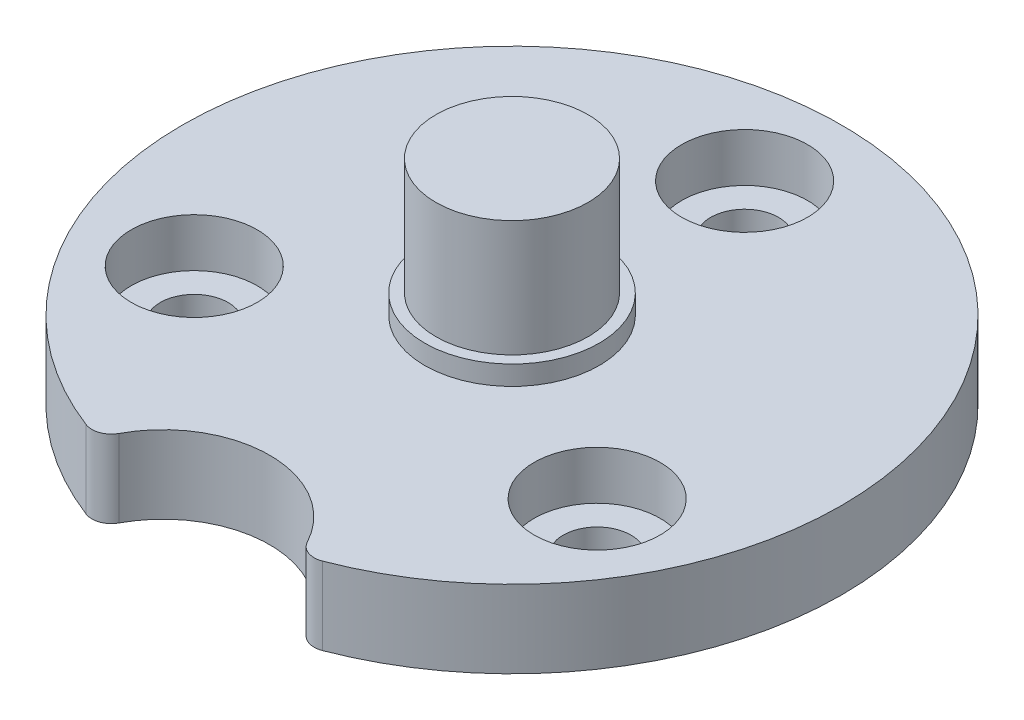
ISO-10303-21;
HEADER;
FILE_DESCRIPTION(('STEP AP214'),'2;1');
FILE_NAME('part.step','',(''),(''),'','','');
FILE_SCHEMA(('AUTOMOTIVE_DESIGN { 1 0 10303 214 1 1 1 1 }'));
ENDSEC;
DATA;
#1=APPLICATION_CONTEXT('core data for automotive mechanical design processes');
#2=APPLICATION_PROTOCOL_DEFINITION('international standard','automotive_design',2000,#1);
#3=PRODUCT_CONTEXT('',#1,'mechanical');
#4=PRODUCT('Part','Part','',(#3));
#5=PRODUCT_RELATED_PRODUCT_CATEGORY('part','',(#4));
#6=PRODUCT_DEFINITION_FORMATION('','',#4);
#7=PRODUCT_DEFINITION_CONTEXT('part definition',#1,'design');
#8=PRODUCT_DEFINITION('design','',#6,#7);
#9=PRODUCT_DEFINITION_SHAPE('','',#8);
#10=(LENGTH_UNIT() NAMED_UNIT(*) SI_UNIT(.MILLI.,.METRE.));
#11=(NAMED_UNIT(*) PLANE_ANGLE_UNIT() SI_UNIT($,.RADIAN.));
#12=(NAMED_UNIT(*) SI_UNIT($,.STERADIAN.) SOLID_ANGLE_UNIT());
#13=UNCERTAINTY_MEASURE_WITH_UNIT(LENGTH_MEASURE(1.E-05),#10,'distance_accuracy_value','');
#14=(GEOMETRIC_REPRESENTATION_CONTEXT(3) GLOBAL_UNCERTAINTY_ASSIGNED_CONTEXT((#13)) GLOBAL_UNIT_ASSIGNED_CONTEXT((#10,
#11,#12)) REPRESENTATION_CONTEXT('',''));
#15=CARTESIAN_POINT('',(0.,0.,0.));
#16=DIRECTION('',(0.,0.,1.));
#17=DIRECTION('',(1.,0.,0.));
#18=AXIS2_PLACEMENT_3D('',#15,#16,#17);
#19=CARTESIAN_POINT('',(0.,4.,-12.));
#20=DIRECTION('',(0.,-1.,0.));
#21=DIRECTION('',(0.,0.,-1.));
#22=AXIS2_PLACEMENT_3D('',#19,#20,#21);
#23=CYLINDRICAL_SURFACE('',#22,1.75);
#24=CARTESIAN_POINT('',(0.,0.,-12.));
#25=DIRECTION('',(0.,1.,0.));
#26=DIRECTION('',(0.,0.,1.));
#27=AXIS2_PLACEMENT_3D('',#24,#25,#26);
#28=CIRCLE('',#27,1.75);
#29=CARTESIAN_POINT('',(0.,0.,-10.25));
#30=VERTEX_POINT('',#29);
#31=EDGE_CURVE('E145',#30,#30,#28,.T.);
#32=ORIENTED_EDGE('',*,*,#31,.F.);
#33=EDGE_LOOP('',(#32));
#34=FACE_BOUND('',#33,.T.);
#35=CARTESIAN_POINT('',(0.,1.5,-12.));
#36=DIRECTION('',(0.,1.,0.));
#37=DIRECTION('',(0.,0.,1.));
#38=AXIS2_PLACEMENT_3D('',#35,#36,#37);
#39=CIRCLE('',#38,1.75);
#40=CARTESIAN_POINT('',(0.,1.5,-10.25));
#41=VERTEX_POINT('',#40);
#42=EDGE_CURVE('E142',#41,#41,#39,.T.);
#43=ORIENTED_EDGE('',*,*,#42,.T.);
#44=EDGE_LOOP('',(#43));
#45=FACE_BOUND('',#44,.T.);
#46=ADVANCED_FACE('F40',(#34,#45),#23,.F.);
#47=CARTESIAN_POINT('',(10.3923048454138,4.,5.99999999999971));
#48=DIRECTION('',(0.,-1.,0.));
#49=DIRECTION('',(0.,0.,-1.));
#50=AXIS2_PLACEMENT_3D('',#47,#48,#49);
#51=CYLINDRICAL_SURFACE('',#50,1.75);
#52=CARTESIAN_POINT('',(10.3923048454138,0.,5.99999999999971));
#53=DIRECTION('',(0.,1.,0.));
#54=DIRECTION('',(0.,0.,1.));
#55=AXIS2_PLACEMENT_3D('',#52,#53,#54);
#56=CIRCLE('',#55,1.75);
#57=CARTESIAN_POINT('',(10.3923048454138,0.,7.74999999999971));
#58=VERTEX_POINT('',#57);
#59=EDGE_CURVE('E141',#58,#58,#56,.T.);
#60=ORIENTED_EDGE('',*,*,#59,.F.);
#61=EDGE_LOOP('',(#60));
#62=FACE_BOUND('',#61,.T.);
#63=CARTESIAN_POINT('',(10.3923048454138,1.5,5.99999999999971));
#64=DIRECTION('',(0.,1.,0.));
#65=DIRECTION('',(0.,0.,1.));
#66=AXIS2_PLACEMENT_3D('',#63,#64,#65);
#67=CIRCLE('',#66,1.75);
#68=CARTESIAN_POINT('',(10.3923048454138,1.5,7.74999999999971));
#69=VERTEX_POINT('',#68);
#70=EDGE_CURVE('E153',#69,#69,#67,.T.);
#71=ORIENTED_EDGE('',*,*,#70,.T.);
#72=EDGE_LOOP('',(#71));
#73=FACE_BOUND('',#72,.T.);
#74=ADVANCED_FACE('F193',(#62,#73),#51,.F.);
#75=CARTESIAN_POINT('',(-10.3923048454128,4.,6.0000000000003));
#76=DIRECTION('',(0.,-1.,0.));
#77=DIRECTION('',(0.,0.,-1.));
#78=AXIS2_PLACEMENT_3D('',#75,#76,#77);
#79=CYLINDRICAL_SURFACE('',#78,1.75);
#80=CARTESIAN_POINT('',(-10.3923048454128,0.,6.0000000000003));
#81=DIRECTION('',(0.,1.,0.));
#82=DIRECTION('',(0.,0.,1.));
#83=AXIS2_PLACEMENT_3D('',#80,#81,#82);
#84=CIRCLE('',#83,1.75);
#85=CARTESIAN_POINT('',(-10.3923048454128,0.,7.7500000000003));
#86=VERTEX_POINT('',#85);
#87=EDGE_CURVE('E138',#86,#86,#84,.T.);
#88=ORIENTED_EDGE('',*,*,#87,.F.);
#89=EDGE_LOOP('',(#88));
#90=FACE_BOUND('',#89,.T.);
#91=CARTESIAN_POINT('',(-10.3923048454128,1.5,6.0000000000003));
#92=DIRECTION('',(0.,1.,0.));
#93=DIRECTION('',(0.,0.,1.));
#94=AXIS2_PLACEMENT_3D('',#91,#92,#93);
#95=CIRCLE('',#94,1.75);
#96=CARTESIAN_POINT('',(-10.3923048454128,1.5,7.7500000000003));
#97=VERTEX_POINT('',#96);
#98=EDGE_CURVE('E123',#97,#97,#95,.T.);
#99=ORIENTED_EDGE('',*,*,#98,.T.);
#100=EDGE_LOOP('',(#99));
#101=FACE_BOUND('',#100,.T.);
#102=ADVANCED_FACE('F167',(#90,#101),#79,.F.);
#103=CARTESIAN_POINT('',(0.,4.,0.));
#104=DIRECTION('',(0.,1.,0.));
#105=DIRECTION('',(0.,0.,1.));
#106=AXIS2_PLACEMENT_3D('',#103,#104,#105);
#107=PLANE('',#106);
#108=CARTESIAN_POINT('',(0.,4.,0.));
#109=DIRECTION('',(0.,1.,0.));
#110=DIRECTION('',(0.,0.,1.));
#111=AXIS2_PLACEMENT_3D('',#108,#109,#110);
#112=CIRCLE('',#111,17.);
#113=CARTESIAN_POINT('',(6.09166505798792,4.,15.87109375));
#114=VERTEX_POINT('',#113);
#115=CARTESIAN_POINT('',(-6.09166505798792,4.,15.87109375));
#116=VERTEX_POINT('',#115);
#117=EDGE_CURVE('E113',#114,#116,#112,.T.);
#118=ORIENTED_EDGE('',*,*,#117,.T.);
#119=CARTESIAN_POINT('',(-5.73333181928275,4.,14.9375));
#120=DIRECTION('',(0.,1.,0.));
#121=DIRECTION('',(0.,0.,1.));
#122=AXIS2_PLACEMENT_3D('',#119,#120,#121);
#123=CIRCLE('',#122,1.);
#124=CARTESIAN_POINT('',(-4.85128077016232,4.,15.4086538461538));
#125=VERTEX_POINT('',#124);
#126=EDGE_CURVE('E11',#116,#125,#123,.T.);
#127=ORIENTED_EDGE('',*,*,#126,.T.);
#128=CARTESIAN_POINT('',(0.,4.,18.));
#129=DIRECTION('',(0.,1.,0.));
#130=DIRECTION('',(0.,0.,1.));
#131=AXIS2_PLACEMENT_3D('',#128,#129,#130);
#132=CIRCLE('',#131,5.5);
#133=CARTESIAN_POINT('',(4.85128077016232,4.,15.4086538461538));
#134=VERTEX_POINT('',#133);
#135=EDGE_CURVE('E97',#134,#125,#132,.T.);
#136=ORIENTED_EDGE('',*,*,#135,.F.);
#137=CARTESIAN_POINT('',(5.73333181928275,4.,14.9375));
#138=DIRECTION('',(0.,1.,0.));
#139=DIRECTION('',(0.,0.,1.));
#140=AXIS2_PLACEMENT_3D('',#137,#138,#139);
#141=CIRCLE('',#140,1.);
#142=EDGE_CURVE('E48',#134,#114,#141,.T.);
#143=ORIENTED_EDGE('',*,*,#142,.T.);
#144=EDGE_LOOP('',(#118,#127,#136,#143));
#145=FACE_BOUND('',#144,.T.);
#146=CARTESIAN_POINT('',(0.,4.,0.));
#147=DIRECTION('',(0.,1.,0.));
#148=DIRECTION('',(0.,0.,1.));
#149=AXIS2_PLACEMENT_3D('',#146,#147,#148);
#150=CIRCLE('',#149,4.5);
#151=CARTESIAN_POINT('',(0.,4.,4.5));
#152=VERTEX_POINT('',#151);
#153=EDGE_CURVE('E106',#152,#152,#150,.T.);
#154=ORIENTED_EDGE('',*,*,#153,.F.);
#155=EDGE_LOOP('',(#154));
#156=FACE_BOUND('',#155,.T.);
#157=CARTESIAN_POINT('',(0.,4.,-12.));
#158=DIRECTION('',(0.,1.,0.));
#159=DIRECTION('',(0.,0.,1.));
#160=AXIS2_PLACEMENT_3D('',#157,#158,#159);
#161=CIRCLE('',#160,3.25);
#162=CARTESIAN_POINT('',(0.,4.,-8.75));
#163=VERTEX_POINT('',#162);
#164=EDGE_CURVE('E124',#163,#163,#161,.T.);
#165=ORIENTED_EDGE('',*,*,#164,.F.);
#166=EDGE_LOOP('',(#165));
#167=FACE_BOUND('',#166,.T.);
#168=CARTESIAN_POINT('',(10.3923048454133,4.,6.));
#169=DIRECTION('',(0.,1.,0.));
#170=DIRECTION('',(0.,0.,1.));
#171=AXIS2_PLACEMENT_3D('',#168,#169,#170);
#172=CIRCLE('',#171,3.25);
#173=CARTESIAN_POINT('',(10.3923048454133,4.,9.25));
#174=VERTEX_POINT('',#173);
#175=EDGE_CURVE('E130',#174,#174,#172,.T.);
#176=ORIENTED_EDGE('',*,*,#175,.F.);
#177=EDGE_LOOP('',(#176));
#178=FACE_BOUND('',#177,.T.);
#179=CARTESIAN_POINT('',(-10.3923048454133,4.,6.00000000000001));
#180=DIRECTION('',(0.,1.,0.));
#181=DIRECTION('',(0.,0.,1.));
#182=AXIS2_PLACEMENT_3D('',#179,#180,#181);
#183=CIRCLE('',#182,3.25);
#184=CARTESIAN_POINT('',(-10.3923048454133,4.,9.25000000000001));
#185=VERTEX_POINT('',#184);
#186=EDGE_CURVE('E117',#185,#185,#183,.T.);
#187=ORIENTED_EDGE('',*,*,#186,.F.);
#188=EDGE_LOOP('',(#187));
#189=FACE_BOUND('',#188,.T.);
#190=ADVANCED_FACE('F164',(#145,#156,#167,#178,#189),#107,.T.);
#191=CARTESIAN_POINT('',(0.,0.,0.));
#192=DIRECTION('',(0.,1.,0.));
#193=DIRECTION('',(0.,0.,1.));
#194=AXIS2_PLACEMENT_3D('',#191,#192,#193);
#195=PLANE('',#194);
#196=CARTESIAN_POINT('',(0.,0.,18.));
#197=DIRECTION('',(0.,1.,0.));
#198=DIRECTION('',(0.,0.,1.));
#199=AXIS2_PLACEMENT_3D('',#196,#197,#198);
#200=CIRCLE('',#199,5.5);
#201=CARTESIAN_POINT('',(-4.85128077016232,0.,15.4086538461538));
#202=VERTEX_POINT('',#201);
#203=CARTESIAN_POINT('',(4.85128077016232,0.,15.4086538461538));
#204=VERTEX_POINT('',#203);
#205=EDGE_CURVE('E95',#202,#204,#200,.F.);
#206=ORIENTED_EDGE('',*,*,#205,.F.);
#207=CARTESIAN_POINT('',(-5.73333181928275,0.,14.9375));
#208=DIRECTION('',(0.,1.,0.));
#209=DIRECTION('',(0.,0.,1.));
#210=AXIS2_PLACEMENT_3D('',#207,#208,#209);
#211=CIRCLE('',#210,1.);
#212=CARTESIAN_POINT('',(-6.09166505798792,0.,15.87109375));
#213=VERTEX_POINT('',#212);
#214=EDGE_CURVE('E79',#202,#213,#211,.F.);
#215=ORIENTED_EDGE('',*,*,#214,.T.);
#216=CARTESIAN_POINT('',(0.,0.,0.));
#217=DIRECTION('',(0.,1.,0.));
#218=DIRECTION('',(0.,0.,1.));
#219=AXIS2_PLACEMENT_3D('',#216,#217,#218);
#220=CIRCLE('',#219,17.);
#221=CARTESIAN_POINT('',(6.09166505798792,0.,15.87109375));
#222=VERTEX_POINT('',#221);
#223=EDGE_CURVE('E148',#222,#213,#220,.T.);
#224=ORIENTED_EDGE('',*,*,#223,.F.);
#225=CARTESIAN_POINT('',(5.73333181928275,0.,14.9375));
#226=DIRECTION('',(0.,1.,0.));
#227=DIRECTION('',(0.,0.,1.));
#228=AXIS2_PLACEMENT_3D('',#225,#226,#227);
#229=CIRCLE('',#228,1.);
#230=EDGE_CURVE('E88',#222,#204,#229,.F.);
#231=ORIENTED_EDGE('',*,*,#230,.T.);
#232=EDGE_LOOP('',(#206,#215,#224,#231));
#233=FACE_BOUND('',#232,.T.);
#234=ORIENTED_EDGE('',*,*,#31,.T.);
#235=EDGE_LOOP('',(#234));
#236=FACE_BOUND('',#235,.T.);
#237=ORIENTED_EDGE('',*,*,#59,.T.);
#238=EDGE_LOOP('',(#237));
#239=FACE_BOUND('',#238,.T.);
#240=ORIENTED_EDGE('',*,*,#87,.T.);
#241=EDGE_LOOP('',(#240));
#242=FACE_BOUND('',#241,.T.);
#243=ADVANCED_FACE('F100',(#233,#236,#239,#242),#195,.F.);
#244=CARTESIAN_POINT('',(0.,4.,0.));
#245=DIRECTION('',(0.,-1.,0.));
#246=DIRECTION('',(0.,0.,-1.));
#247=AXIS2_PLACEMENT_3D('',#244,#245,#246);
#248=CYLINDRICAL_SURFACE('',#247,17.);
#249=ORIENTED_EDGE('',*,*,#223,.T.);
#250=DIRECTION('',(0.,-1.,0.));
#251=VECTOR('',#250,1.);
#252=CARTESIAN_POINT('',(-6.09166505798792,4.,15.87109375));
#253=LINE('',#252,#251);
#254=EDGE_CURVE('E55',#213,#116,#253,.F.);
#255=ORIENTED_EDGE('',*,*,#254,.T.);
#256=ORIENTED_EDGE('',*,*,#117,.F.);
#257=DIRECTION('',(0.,-1.,0.));
#258=VECTOR('',#257,1.);
#259=CARTESIAN_POINT('',(6.09166505798792,4.,15.87109375));
#260=LINE('',#259,#258);
#261=EDGE_CURVE('E87',#114,#222,#260,.T.);
#262=ORIENTED_EDGE('',*,*,#261,.T.);
#263=EDGE_LOOP('',(#249,#255,#256,#262));
#264=FACE_BOUND('',#263,.T.);
#265=ADVANCED_FACE('F162',(#264),#248,.T.);
#266=CARTESIAN_POINT('',(-10.3923048454133,1.5,6.00000000000001));
#267=DIRECTION('',(0.,1.,0.));
#268=DIRECTION('',(0.,0.,1.));
#269=AXIS2_PLACEMENT_3D('',#266,#267,#268);
#270=CYLINDRICAL_SURFACE('',#269,3.25);
#271=CARTESIAN_POINT('',(-10.3923048454133,1.5,6.00000000000001));
#272=DIRECTION('',(0.,1.,0.));
#273=DIRECTION('',(0.,0.,1.));
#274=AXIS2_PLACEMENT_3D('',#271,#272,#273);
#275=CIRCLE('',#274,3.25);
#276=CARTESIAN_POINT('',(-10.3923048454133,1.5,9.25000000000001));
#277=VERTEX_POINT('',#276);
#278=EDGE_CURVE('E133',#277,#277,#275,.T.);
#279=ORIENTED_EDGE('',*,*,#278,.F.);
#280=EDGE_LOOP('',(#279));
#281=FACE_BOUND('',#280,.T.);
#282=ORIENTED_EDGE('',*,*,#186,.T.);
#283=EDGE_LOOP('',(#282));
#284=FACE_BOUND('',#283,.T.);
#285=ADVANCED_FACE('F177',(#281,#284),#270,.F.);
#286=CARTESIAN_POINT('',(-10.3923048454133,1.5,6.00000000000001));
#287=DIRECTION('',(0.,1.,0.));
#288=DIRECTION('',(0.,0.,1.));
#289=AXIS2_PLACEMENT_3D('',#286,#287,#288);
#290=PLANE('',#289);
#291=ORIENTED_EDGE('',*,*,#98,.F.);
#292=EDGE_LOOP('',(#291));
#293=FACE_BOUND('',#292,.T.);
#294=ORIENTED_EDGE('',*,*,#278,.T.);
#295=EDGE_LOOP('',(#294));
#296=FACE_BOUND('',#295,.T.);
#297=ADVANCED_FACE('F179',(#293,#296),#290,.T.);
#298=CARTESIAN_POINT('',(10.3923048454133,1.5,6.));
#299=DIRECTION('',(0.,1.,0.));
#300=DIRECTION('',(0.,0.,1.));
#301=AXIS2_PLACEMENT_3D('',#298,#299,#300);
#302=CYLINDRICAL_SURFACE('',#301,3.25);
#303=CARTESIAN_POINT('',(10.3923048454133,1.5,6.));
#304=DIRECTION('',(0.,1.,0.));
#305=DIRECTION('',(0.,0.,1.));
#306=AXIS2_PLACEMENT_3D('',#303,#304,#305);
#307=CIRCLE('',#306,3.25);
#308=CARTESIAN_POINT('',(10.3923048454133,1.5,9.25));
#309=VERTEX_POINT('',#308);
#310=EDGE_CURVE('E127',#309,#309,#307,.T.);
#311=ORIENTED_EDGE('',*,*,#310,.F.);
#312=EDGE_LOOP('',(#311));
#313=FACE_BOUND('',#312,.T.);
#314=ORIENTED_EDGE('',*,*,#175,.T.);
#315=EDGE_LOOP('',(#314));
#316=FACE_BOUND('',#315,.T.);
#317=ADVANCED_FACE('F186',(#313,#316),#302,.F.);
#318=CARTESIAN_POINT('',(10.3923048454133,1.5,6.));
#319=DIRECTION('',(0.,1.,0.));
#320=DIRECTION('',(0.,0.,1.));
#321=AXIS2_PLACEMENT_3D('',#318,#319,#320);
#322=PLANE('',#321);
#323=ORIENTED_EDGE('',*,*,#70,.F.);
#324=EDGE_LOOP('',(#323));
#325=FACE_BOUND('',#324,.T.);
#326=ORIENTED_EDGE('',*,*,#310,.T.);
#327=EDGE_LOOP('',(#326));
#328=FACE_BOUND('',#327,.T.);
#329=ADVANCED_FACE('F237',(#325,#328),#322,.T.);
#330=CARTESIAN_POINT('',(0.,1.5,-12.));
#331=DIRECTION('',(0.,1.,0.));
#332=DIRECTION('',(0.,0.,1.));
#333=AXIS2_PLACEMENT_3D('',#330,#331,#332);
#334=CYLINDRICAL_SURFACE('',#333,3.25);
#335=CARTESIAN_POINT('',(0.,1.5,-12.));
#336=DIRECTION('',(0.,1.,0.));
#337=DIRECTION('',(0.,0.,1.));
#338=AXIS2_PLACEMENT_3D('',#335,#336,#337);
#339=CIRCLE('',#338,3.25);
#340=CARTESIAN_POINT('',(0.,1.5,-8.75));
#341=VERTEX_POINT('',#340);
#342=EDGE_CURVE('E120',#341,#341,#339,.T.);
#343=ORIENTED_EDGE('',*,*,#342,.F.);
#344=EDGE_LOOP('',(#343));
#345=FACE_BOUND('',#344,.T.);
#346=ORIENTED_EDGE('',*,*,#164,.T.);
#347=EDGE_LOOP('',(#346));
#348=FACE_BOUND('',#347,.T.);
#349=ADVANCED_FACE('F233',(#345,#348),#334,.F.);
#350=CARTESIAN_POINT('',(0.,1.5,-12.));
#351=DIRECTION('',(0.,1.,0.));
#352=DIRECTION('',(0.,0.,1.));
#353=AXIS2_PLACEMENT_3D('',#350,#351,#352);
#354=PLANE('',#353);
#355=ORIENTED_EDGE('',*,*,#42,.F.);
#356=EDGE_LOOP('',(#355));
#357=FACE_BOUND('',#356,.T.);
#358=ORIENTED_EDGE('',*,*,#342,.T.);
#359=EDGE_LOOP('',(#358));
#360=FACE_BOUND('',#359,.T.);
#361=ADVANCED_FACE('F229',(#357,#360),#354,.T.);
#362=CARTESIAN_POINT('',(0.,5.,0.));
#363=DIRECTION('',(0.,-1.,0.));
#364=DIRECTION('',(0.,0.,-1.));
#365=AXIS2_PLACEMENT_3D('',#362,#363,#364);
#366=CYLINDRICAL_SURFACE('',#365,4.5);
#367=CARTESIAN_POINT('',(0.,5.,0.));
#368=DIRECTION('',(0.,1.,0.));
#369=DIRECTION('',(0.,0.,1.));
#370=AXIS2_PLACEMENT_3D('',#367,#368,#369);
#371=CIRCLE('',#370,4.5);
#372=CARTESIAN_POINT('',(0.,5.,4.5));
#373=VERTEX_POINT('',#372);
#374=EDGE_CURVE('E114',#373,#373,#371,.T.);
#375=ORIENTED_EDGE('',*,*,#374,.F.);
#376=EDGE_LOOP('',(#375));
#377=FACE_BOUND('',#376,.T.);
#378=ORIENTED_EDGE('',*,*,#153,.T.);
#379=EDGE_LOOP('',(#378));
#380=FACE_BOUND('',#379,.T.);
#381=ADVANCED_FACE('F225',(#377,#380),#366,.T.);
#382=CARTESIAN_POINT('',(0.,5.,0.));
#383=DIRECTION('',(0.,1.,0.));
#384=DIRECTION('',(0.,0.,1.));
#385=AXIS2_PLACEMENT_3D('',#382,#383,#384);
#386=PLANE('',#385);
#387=CARTESIAN_POINT('',(0.,5.,0.));
#388=DIRECTION('',(0.,1.,0.));
#389=DIRECTION('',(0.,0.,1.));
#390=AXIS2_PLACEMENT_3D('',#387,#388,#389);
#391=CIRCLE('',#390,3.925);
#392=CARTESIAN_POINT('',(0.,5.,3.925));
#393=VERTEX_POINT('',#392);
#394=EDGE_CURVE('E110',#393,#393,#391,.T.);
#395=ORIENTED_EDGE('',*,*,#394,.F.);
#396=EDGE_LOOP('',(#395));
#397=FACE_BOUND('',#396,.T.);
#398=ORIENTED_EDGE('',*,*,#374,.T.);
#399=EDGE_LOOP('',(#398));
#400=FACE_BOUND('',#399,.T.);
#401=ADVANCED_FACE('F221',(#397,#400),#386,.T.);
#402=CARTESIAN_POINT('',(0.,11.,0.));
#403=DIRECTION('',(0.,-1.,0.));
#404=DIRECTION('',(0.,0.,-1.));
#405=AXIS2_PLACEMENT_3D('',#402,#403,#404);
#406=CYLINDRICAL_SURFACE('',#405,3.925);
#407=CARTESIAN_POINT('',(0.,11.,0.));
#408=DIRECTION('',(0.,1.,0.));
#409=DIRECTION('',(0.,0.,1.));
#410=AXIS2_PLACEMENT_3D('',#407,#408,#409);
#411=CIRCLE('',#410,3.925);
#412=CARTESIAN_POINT('',(0.,11.,3.925));
#413=VERTEX_POINT('',#412);
#414=EDGE_CURVE('E103',#413,#413,#411,.T.);
#415=ORIENTED_EDGE('',*,*,#414,.F.);
#416=EDGE_LOOP('',(#415));
#417=FACE_BOUND('',#416,.T.);
#418=ORIENTED_EDGE('',*,*,#394,.T.);
#419=EDGE_LOOP('',(#418));
#420=FACE_BOUND('',#419,.T.);
#421=ADVANCED_FACE('F215',(#417,#420),#406,.T.);
#422=CARTESIAN_POINT('',(0.,11.,0.));
#423=DIRECTION('',(0.,1.,0.));
#424=DIRECTION('',(0.,0.,1.));
#425=AXIS2_PLACEMENT_3D('',#422,#423,#424);
#426=PLANE('',#425);
#427=ORIENTED_EDGE('',*,*,#414,.T.);
#428=EDGE_LOOP('',(#427));
#429=FACE_BOUND('',#428,.T.);
#430=ADVANCED_FACE('F210',(#429),#426,.T.);
#431=CARTESIAN_POINT('',(0.,-0.00100000000000013,18.));
#432=DIRECTION('',(0.,1.,0.));
#433=DIRECTION('',(0.,0.,1.));
#434=AXIS2_PLACEMENT_3D('',#431,#432,#433);
#435=CYLINDRICAL_SURFACE('',#434,5.5);
#436=ORIENTED_EDGE('',*,*,#135,.T.);
#437=DIRECTION('',(0.,1.,0.));
#438=VECTOR('',#437,1.);
#439=CARTESIAN_POINT('',(-4.85128077016232,-0.00100000000000013,15.4086538461538));
#440=LINE('',#439,#438);
#441=EDGE_CURVE('E83',#125,#202,#440,.F.);
#442=ORIENTED_EDGE('',*,*,#441,.T.);
#443=ORIENTED_EDGE('',*,*,#205,.T.);
#444=DIRECTION('',(0.,1.,0.));
#445=VECTOR('',#444,1.);
#446=CARTESIAN_POINT('',(4.85128077016232,-0.00100000000000013,15.4086538461538));
#447=LINE('',#446,#445);
#448=EDGE_CURVE('E98',#204,#134,#447,.T.);
#449=ORIENTED_EDGE('',*,*,#448,.T.);
#450=EDGE_LOOP('',(#436,#442,#443,#449));
#451=FACE_BOUND('',#450,.T.);
#452=ADVANCED_FACE('F93',(#451),#435,.F.);
#453=CARTESIAN_POINT('',(-5.73333181928275,4.,14.9375));
#454=DIRECTION('',(0.,1.,0.));
#455=DIRECTION('',(0.,0.,1.));
#456=AXIS2_PLACEMENT_3D('',#453,#454,#455);
#457=CYLINDRICAL_SURFACE('',#456,1.);
#458=ORIENTED_EDGE('',*,*,#126,.F.);
#459=ORIENTED_EDGE('',*,*,#254,.F.);
#460=ORIENTED_EDGE('',*,*,#214,.F.);
#461=ORIENTED_EDGE('',*,*,#441,.F.);
#462=EDGE_LOOP('',(#458,#459,#460,#461));
#463=FACE_BOUND('',#462,.T.);
#464=ADVANCED_FACE('F82',(#463),#457,.T.);
#465=CARTESIAN_POINT('',(5.73333181928275,4.,14.9375));
#466=DIRECTION('',(0.,-1.,0.));
#467=DIRECTION('',(0.,0.,-1.));
#468=AXIS2_PLACEMENT_3D('',#465,#466,#467);
#469=CYLINDRICAL_SURFACE('',#468,1.);
#470=ORIENTED_EDGE('',*,*,#230,.F.);
#471=ORIENTED_EDGE('',*,*,#261,.F.);
#472=ORIENTED_EDGE('',*,*,#142,.F.);
#473=ORIENTED_EDGE('',*,*,#448,.F.);
#474=EDGE_LOOP('',(#470,#471,#472,#473));
#475=FACE_BOUND('',#474,.T.);
#476=ADVANCED_FACE('F42',(#475),#469,.T.);
#477=CLOSED_SHELL('',(#46,#74,#102,#190,#243,#265,#285,#297,#317,#329,#349,#361,#381,#401,#421,
#430,#452,#464,#476));
#478=MANIFOLD_SOLID_BREP('B2',#477);
#479=ADVANCED_BREP_SHAPE_REPRESENTATION('',(#18,#478),#14);
#480=SHAPE_DEFINITION_REPRESENTATION(#9,#479);
ENDSEC;
END-ISO-10303-21;
